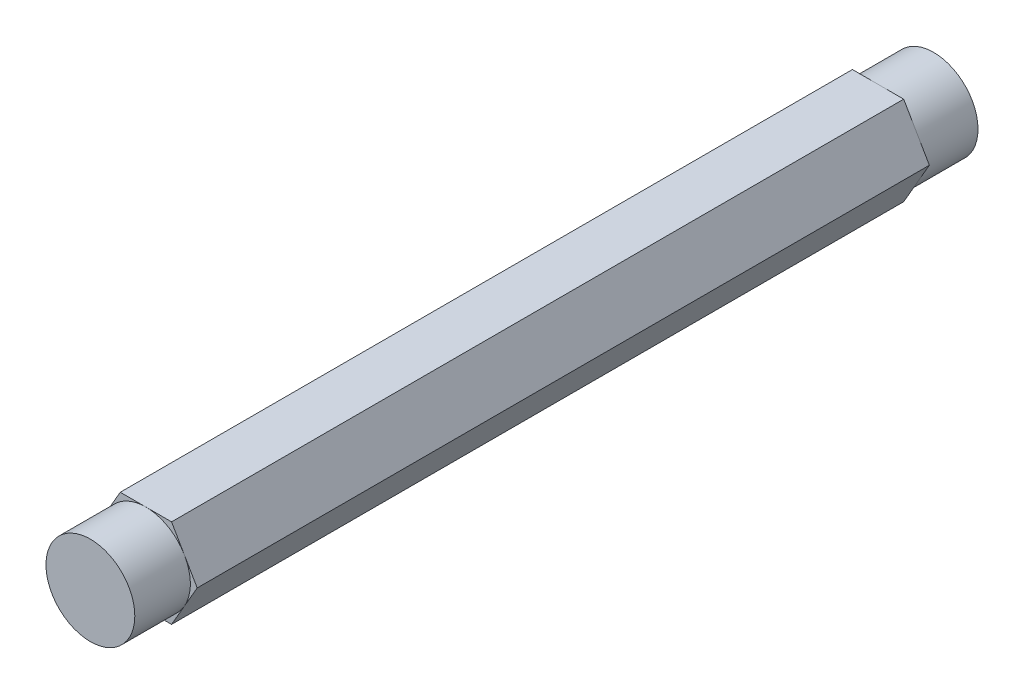
ISO-10303-21;
HEADER;
FILE_DESCRIPTION(('STEP AP214'),'2;1');
FILE_NAME('part.step','',(''),(''),'','','');
FILE_SCHEMA(('AUTOMOTIVE_DESIGN { 1 0 10303 214 1 1 1 1 }'));
ENDSEC;
DATA;
#1=APPLICATION_CONTEXT('core data for automotive mechanical design processes');
#2=APPLICATION_PROTOCOL_DEFINITION('international standard','automotive_design',2000,#1);
#3=PRODUCT_CONTEXT('',#1,'mechanical');
#4=PRODUCT('Part','Part','',(#3));
#5=PRODUCT_RELATED_PRODUCT_CATEGORY('part','',(#4));
#6=PRODUCT_DEFINITION_FORMATION('','',#4);
#7=PRODUCT_DEFINITION_CONTEXT('part definition',#1,'design');
#8=PRODUCT_DEFINITION('design','',#6,#7);
#9=PRODUCT_DEFINITION_SHAPE('','',#8);
#10=(LENGTH_UNIT() NAMED_UNIT(*) SI_UNIT(.MILLI.,.METRE.));
#11=(NAMED_UNIT(*) PLANE_ANGLE_UNIT() SI_UNIT($,.RADIAN.));
#12=(NAMED_UNIT(*) SI_UNIT($,.STERADIAN.) SOLID_ANGLE_UNIT());
#13=UNCERTAINTY_MEASURE_WITH_UNIT(LENGTH_MEASURE(1.E-05),#10,'distance_accuracy_value','');
#14=(GEOMETRIC_REPRESENTATION_CONTEXT(3) GLOBAL_UNCERTAINTY_ASSIGNED_CONTEXT((#13)) GLOBAL_UNIT_ASSIGNED_CONTEXT((#10,
#11,#12)) REPRESENTATION_CONTEXT('',''));
#15=CARTESIAN_POINT('',(0.,0.,0.));
#16=DIRECTION('',(0.,0.,1.));
#17=DIRECTION('',(1.,0.,0.));
#18=AXIS2_PLACEMENT_3D('',#15,#16,#17);
#19=CARTESIAN_POINT('',(0.,0.,112.6109));
#20=DIRECTION('',(0.,0.,1.));
#21=DIRECTION('',(1.,0.,0.));
#22=AXIS2_PLACEMENT_3D('',#19,#20,#21);
#23=PLANE('',#22);
#24=CARTESIAN_POINT('',(0.,0.,112.6109));
#25=DIRECTION('',(0.,0.,1.));
#26=DIRECTION('',(1.,0.,0.));
#27=AXIS2_PLACEMENT_3D('',#24,#25,#26);
#28=CIRCLE('',#27,6.35);
#29=CARTESIAN_POINT('',(5.49926131403118,3.175,112.6109));
#30=VERTEX_POINT('',#29);
#31=CARTESIAN_POINT('',(0.,6.35,112.6109));
#32=VERTEX_POINT('',#31);
#33=EDGE_CURVE('E46',#30,#32,#28,.T.);
#34=ORIENTED_EDGE('',*,*,#33,.F.);
#35=DIRECTION('',(-0.5,0.866025403784438,0.));
#36=VECTOR('',#35,1.);
#37=CARTESIAN_POINT('',(7.33234841870825,0.,112.6109));
#38=LINE('',#37,#36);
#39=CARTESIAN_POINT('',(3.66617420935412,6.35,112.6109));
#40=VERTEX_POINT('',#39);
#41=EDGE_CURVE('E139',#30,#40,#38,.T.);
#42=ORIENTED_EDGE('',*,*,#41,.T.);
#43=DIRECTION('',(-1.,0.,0.));
#44=VECTOR('',#43,1.);
#45=CARTESIAN_POINT('',(3.66617420935412,6.35,112.6109));
#46=LINE('',#45,#44);
#47=EDGE_CURVE('E152',#40,#32,#46,.T.);
#48=ORIENTED_EDGE('',*,*,#47,.T.);
#49=EDGE_LOOP('',(#34,#42,#48));
#50=FACE_BOUND('',#49,.T.);
#51=ADVANCED_FACE('F35',(#50),#23,.T.);
#52=CARTESIAN_POINT('',(-5.49926131403119,3.175,112.6109));
#53=VERTEX_POINT('',#52);
#54=EDGE_CURVE('E11',#32,#53,#28,.T.);
#55=ORIENTED_EDGE('',*,*,#54,.F.);
#56=CARTESIAN_POINT('',(-3.66617420935412,6.35,112.6109));
#57=VERTEX_POINT('',#56);
#58=EDGE_CURVE('E138',#32,#57,#46,.T.);
#59=ORIENTED_EDGE('',*,*,#58,.T.);
#60=DIRECTION('',(-0.5,-0.866025403784439,0.));
#61=VECTOR('',#60,1.);
#62=CARTESIAN_POINT('',(-3.66617420935412,6.35,112.6109));
#63=LINE('',#62,#61);
#64=EDGE_CURVE('E165',#57,#53,#63,.T.);
#65=ORIENTED_EDGE('',*,*,#64,.T.);
#66=EDGE_LOOP('',(#55,#59,#65));
#67=FACE_BOUND('',#66,.T.);
#68=ADVANCED_FACE('F265',(#67),#23,.T.);
#69=CARTESIAN_POINT('',(-5.49926131403118,-3.175,112.6109));
#70=VERTEX_POINT('',#69);
#71=EDGE_CURVE('E44',#53,#70,#28,.T.);
#72=ORIENTED_EDGE('',*,*,#71,.F.);
#73=CARTESIAN_POINT('',(-7.33234841870825,0.,112.6109));
#74=VERTEX_POINT('',#73);
#75=EDGE_CURVE('E164',#53,#74,#63,.T.);
#76=ORIENTED_EDGE('',*,*,#75,.T.);
#77=DIRECTION('',(0.5,-0.866025403784439,0.));
#78=VECTOR('',#77,1.);
#79=CARTESIAN_POINT('',(-7.33234841870825,0.,112.6109));
#80=LINE('',#79,#78);
#81=EDGE_CURVE('E169',#74,#70,#80,.T.);
#82=ORIENTED_EDGE('',*,*,#81,.T.);
#83=EDGE_LOOP('',(#72,#76,#82));
#84=FACE_BOUND('',#83,.T.);
#85=ADVANCED_FACE('F269',(#84),#23,.T.);
#86=CARTESIAN_POINT('',(0.,-6.35,112.6109));
#87=VERTEX_POINT('',#86);
#88=EDGE_CURVE('E61',#70,#87,#28,.T.);
#89=ORIENTED_EDGE('',*,*,#88,.F.);
#90=CARTESIAN_POINT('',(-3.66617420935412,-6.35,112.6109));
#91=VERTEX_POINT('',#90);
#92=EDGE_CURVE('E168',#70,#91,#80,.T.);
#93=ORIENTED_EDGE('',*,*,#92,.T.);
#94=DIRECTION('',(1.,0.,0.));
#95=VECTOR('',#94,1.);
#96=CARTESIAN_POINT('',(-3.66617420935412,-6.35,112.6109));
#97=LINE('',#96,#95);
#98=EDGE_CURVE('E173',#91,#87,#97,.T.);
#99=ORIENTED_EDGE('',*,*,#98,.T.);
#100=EDGE_LOOP('',(#89,#93,#99));
#101=FACE_BOUND('',#100,.T.);
#102=ADVANCED_FACE('F262',(#101),#23,.T.);
#103=CARTESIAN_POINT('',(5.49926131403119,-3.175,112.6109));
#104=VERTEX_POINT('',#103);
#105=EDGE_CURVE('E53',#87,#104,#28,.T.);
#106=ORIENTED_EDGE('',*,*,#105,.F.);
#107=CARTESIAN_POINT('',(3.66617420935413,-6.35,112.6109));
#108=VERTEX_POINT('',#107);
#109=EDGE_CURVE('E172',#87,#108,#97,.T.);
#110=ORIENTED_EDGE('',*,*,#109,.T.);
#111=DIRECTION('',(0.5,0.866025403784439,0.));
#112=VECTOR('',#111,1.);
#113=CARTESIAN_POINT('',(3.66617420935413,-6.35,112.6109));
#114=LINE('',#113,#112);
#115=EDGE_CURVE('E150',#108,#104,#114,.T.);
#116=ORIENTED_EDGE('',*,*,#115,.T.);
#117=EDGE_LOOP('',(#106,#110,#116));
#118=FACE_BOUND('',#117,.T.);
#119=ADVANCED_FACE('F256',(#118),#23,.T.);
#120=CARTESIAN_POINT('',(0.,0.,7.9375));
#121=DIRECTION('',(0.,0.,-1.));
#122=DIRECTION('',(-1.,0.,0.));
#123=AXIS2_PLACEMENT_3D('',#120,#121,#122);
#124=CYLINDRICAL_SURFACE('',#123,6.35);
#125=CARTESIAN_POINT('',(0.,0.,7.9375));
#126=DIRECTION('',(0.,0.,1.));
#127=DIRECTION('',(1.,0.,0.));
#128=AXIS2_PLACEMENT_3D('',#125,#126,#127);
#129=CIRCLE('',#128,6.35);
#130=CARTESIAN_POINT('',(5.49926131403118,3.175,7.9375));
#131=VERTEX_POINT('',#130);
#132=CARTESIAN_POINT('',(0.,6.35,7.9375));
#133=VERTEX_POINT('',#132);
#134=EDGE_CURVE('E156',#131,#133,#129,.T.);
#135=ORIENTED_EDGE('',*,*,#134,.F.);
#136=CARTESIAN_POINT('',(5.49926131403119,-3.175,7.9375));
#137=VERTEX_POINT('',#136);
#138=EDGE_CURVE('E159',#137,#131,#129,.T.);
#139=ORIENTED_EDGE('',*,*,#138,.F.);
#140=CARTESIAN_POINT('',(0.,-6.35,7.9375));
#141=VERTEX_POINT('',#140);
#142=EDGE_CURVE('E216',#141,#137,#129,.T.);
#143=ORIENTED_EDGE('',*,*,#142,.F.);
#144=CARTESIAN_POINT('',(-5.49926131403118,-3.175,7.9375));
#145=VERTEX_POINT('',#144);
#146=EDGE_CURVE('E222',#145,#141,#129,.T.);
#147=ORIENTED_EDGE('',*,*,#146,.F.);
#148=CARTESIAN_POINT('',(-5.49926131403119,3.175,7.9375));
#149=VERTEX_POINT('',#148);
#150=EDGE_CURVE('E227',#149,#145,#129,.T.);
#151=ORIENTED_EDGE('',*,*,#150,.F.);
#152=EDGE_CURVE('E158',#133,#149,#129,.T.);
#153=ORIENTED_EDGE('',*,*,#152,.F.);
#154=EDGE_LOOP('',(#135,#139,#143,#147,#151,#153));
#155=FACE_BOUND('',#154,.T.);
#156=CARTESIAN_POINT('',(0.,0.,0.));
#157=DIRECTION('',(0.,0.,1.));
#158=DIRECTION('',(1.,0.,0.));
#159=AXIS2_PLACEMENT_3D('',#156,#157,#158);
#160=CIRCLE('',#159,6.35);
#161=CARTESIAN_POINT('',(6.35,0.,0.));
#162=VERTEX_POINT('',#161);
#163=EDGE_CURVE('E39',#162,#162,#160,.T.);
#164=ORIENTED_EDGE('',*,*,#163,.T.);
#165=EDGE_LOOP('',(#164));
#166=FACE_BOUND('',#165,.T.);
#167=ADVANCED_FACE('F37',(#155,#166),#124,.T.);
#168=CARTESIAN_POINT('',(0.,0.,0.));
#169=DIRECTION('',(0.,0.,1.));
#170=DIRECTION('',(1.,0.,0.));
#171=AXIS2_PLACEMENT_3D('',#168,#169,#170);
#172=PLANE('',#171);
#173=ORIENTED_EDGE('',*,*,#163,.F.);
#174=EDGE_LOOP('',(#173));
#175=FACE_BOUND('',#174,.T.);
#176=ADVANCED_FACE('F255',(#175),#172,.F.);
#177=CARTESIAN_POINT('',(0.,0.,7.9375));
#178=DIRECTION('',(0.,0.,1.));
#179=DIRECTION('',(1.,0.,0.));
#180=AXIS2_PLACEMENT_3D('',#177,#178,#179);
#181=PLANE('',#180);
#182=DIRECTION('',(-0.5,0.866025403784438,0.));
#183=VECTOR('',#182,1.);
#184=CARTESIAN_POINT('',(7.33234841870825,0.,7.9375));
#185=LINE('',#184,#183);
#186=CARTESIAN_POINT('',(3.66617420935412,6.35,7.9375));
#187=VERTEX_POINT('',#186);
#188=EDGE_CURVE('E179',#131,#187,#185,.T.);
#189=ORIENTED_EDGE('',*,*,#188,.F.);
#190=ORIENTED_EDGE('',*,*,#134,.T.);
#191=DIRECTION('',(-1.,0.,0.));
#192=VECTOR('',#191,1.);
#193=CARTESIAN_POINT('',(3.66617420935412,6.35,7.9375));
#194=LINE('',#193,#192);
#195=EDGE_CURVE('E184',#187,#133,#194,.T.);
#196=ORIENTED_EDGE('',*,*,#195,.F.);
#197=EDGE_LOOP('',(#189,#190,#196));
#198=FACE_BOUND('',#197,.T.);
#199=ADVANCED_FACE('F253',(#198),#181,.F.);
#200=CARTESIAN_POINT('',(-3.66617420935412,6.35,7.9375));
#201=VERTEX_POINT('',#200);
#202=EDGE_CURVE('E183',#133,#201,#194,.T.);
#203=ORIENTED_EDGE('',*,*,#202,.F.);
#204=ORIENTED_EDGE('',*,*,#152,.T.);
#205=DIRECTION('',(-0.5,-0.866025403784439,0.));
#206=VECTOR('',#205,1.);
#207=CARTESIAN_POINT('',(-3.66617420935412,6.35,7.9375));
#208=LINE('',#207,#206);
#209=EDGE_CURVE('E188',#201,#149,#208,.T.);
#210=ORIENTED_EDGE('',*,*,#209,.F.);
#211=EDGE_LOOP('',(#203,#204,#210));
#212=FACE_BOUND('',#211,.T.);
#213=ADVANCED_FACE('F239',(#212),#181,.F.);
#214=CARTESIAN_POINT('',(-7.33234841870825,0.,7.9375));
#215=VERTEX_POINT('',#214);
#216=EDGE_CURVE('E187',#149,#215,#208,.T.);
#217=ORIENTED_EDGE('',*,*,#216,.F.);
#218=ORIENTED_EDGE('',*,*,#150,.T.);
#219=DIRECTION('',(0.5,-0.866025403784439,0.));
#220=VECTOR('',#219,1.);
#221=CARTESIAN_POINT('',(-7.33234841870825,0.,7.9375));
#222=LINE('',#221,#220);
#223=EDGE_CURVE('E192',#215,#145,#222,.T.);
#224=ORIENTED_EDGE('',*,*,#223,.F.);
#225=EDGE_LOOP('',(#217,#218,#224));
#226=FACE_BOUND('',#225,.T.);
#227=ADVANCED_FACE('F241',(#226),#181,.F.);
#228=CARTESIAN_POINT('',(-3.66617420935412,-6.35,7.9375));
#229=VERTEX_POINT('',#228);
#230=EDGE_CURVE('E191',#145,#229,#222,.T.);
#231=ORIENTED_EDGE('',*,*,#230,.F.);
#232=ORIENTED_EDGE('',*,*,#146,.T.);
#233=DIRECTION('',(1.,0.,0.));
#234=VECTOR('',#233,1.);
#235=CARTESIAN_POINT('',(-3.66617420935412,-6.35,7.9375));
#236=LINE('',#235,#234);
#237=EDGE_CURVE('E196',#229,#141,#236,.T.);
#238=ORIENTED_EDGE('',*,*,#237,.F.);
#239=EDGE_LOOP('',(#231,#232,#238));
#240=FACE_BOUND('',#239,.T.);
#241=ADVANCED_FACE('F308',(#240),#181,.F.);
#242=CARTESIAN_POINT('',(3.66617420935413,-6.35,7.9375));
#243=VERTEX_POINT('',#242);
#244=EDGE_CURVE('E195',#141,#243,#236,.T.);
#245=ORIENTED_EDGE('',*,*,#244,.F.);
#246=ORIENTED_EDGE('',*,*,#142,.T.);
#247=DIRECTION('',(0.5,0.866025403784439,0.));
#248=VECTOR('',#247,1.);
#249=CARTESIAN_POINT('',(3.66617420935413,-6.35,7.9375));
#250=LINE('',#249,#248);
#251=EDGE_CURVE('E176',#243,#137,#250,.T.);
#252=ORIENTED_EDGE('',*,*,#251,.F.);
#253=EDGE_LOOP('',(#245,#246,#252));
#254=FACE_BOUND('',#253,.T.);
#255=ADVANCED_FACE('F303',(#254),#181,.F.);
#256=CARTESIAN_POINT('',(7.33234841870825,0.,7.9375));
#257=VERTEX_POINT('',#256);
#258=EDGE_CURVE('E180',#137,#257,#250,.T.);
#259=ORIENTED_EDGE('',*,*,#258,.F.);
#260=ORIENTED_EDGE('',*,*,#138,.T.);
#261=EDGE_CURVE('E181',#257,#131,#185,.T.);
#262=ORIENTED_EDGE('',*,*,#261,.F.);
#263=EDGE_LOOP('',(#259,#260,#262));
#264=FACE_BOUND('',#263,.T.);
#265=ADVANCED_FACE('F298',(#264),#181,.F.);
#266=CARTESIAN_POINT('',(3.66617420935413,-6.35,112.6109));
#267=DIRECTION('',(-0.866025403784438,0.5,0.));
#268=DIRECTION('',(-0.5,-0.866025403784439,0.));
#269=AXIS2_PLACEMENT_3D('',#266,#267,#268);
#270=PLANE('',#269);
#271=ORIENTED_EDGE('',*,*,#251,.T.);
#272=ORIENTED_EDGE('',*,*,#258,.T.);
#273=DIRECTION('',(0.,0.,-1.));
#274=VECTOR('',#273,1.);
#275=CARTESIAN_POINT('',(7.33234841870825,0.,112.6109));
#276=LINE('',#275,#274);
#277=CARTESIAN_POINT('',(7.33234841870825,0.,112.6109));
#278=VERTEX_POINT('',#277);
#279=EDGE_CURVE('E211',#278,#257,#276,.T.);
#280=ORIENTED_EDGE('',*,*,#279,.F.);
#281=EDGE_CURVE('E134',#104,#278,#114,.T.);
#282=ORIENTED_EDGE('',*,*,#281,.F.);
#283=ORIENTED_EDGE('',*,*,#115,.F.);
#284=DIRECTION('',(0.,0.,-1.));
#285=VECTOR('',#284,1.);
#286=CARTESIAN_POINT('',(3.66617420935413,-6.35,112.6109));
#287=LINE('',#286,#285);
#288=EDGE_CURVE('E175',#108,#243,#287,.T.);
#289=ORIENTED_EDGE('',*,*,#288,.T.);
#290=EDGE_LOOP('',(#271,#272,#280,#282,#283,#289));
#291=FACE_BOUND('',#290,.T.);
#292=ADVANCED_FACE('F296',(#291),#270,.F.);
#293=CARTESIAN_POINT('',(7.33234841870825,0.,112.6109));
#294=DIRECTION('',(-0.866025403784438,-0.5,0.));
#295=DIRECTION('',(0.5,-0.866025403784438,0.));
#296=AXIS2_PLACEMENT_3D('',#293,#294,#295);
#297=PLANE('',#296);
#298=ORIENTED_EDGE('',*,*,#261,.T.);
#299=ORIENTED_EDGE('',*,*,#188,.T.);
#300=DIRECTION('',(0.,0.,-1.));
#301=VECTOR('',#300,1.);
#302=CARTESIAN_POINT('',(3.66617420935412,6.35,112.6109));
#303=LINE('',#302,#301);
#304=EDGE_CURVE('E146',#40,#187,#303,.T.);
#305=ORIENTED_EDGE('',*,*,#304,.F.);
#306=ORIENTED_EDGE('',*,*,#41,.F.);
#307=EDGE_CURVE('E128',#278,#30,#38,.T.);
#308=ORIENTED_EDGE('',*,*,#307,.F.);
#309=ORIENTED_EDGE('',*,*,#279,.T.);
#310=EDGE_LOOP('',(#298,#299,#305,#306,#308,#309));
#311=FACE_BOUND('',#310,.T.);
#312=ADVANCED_FACE('F144',(#311),#297,.F.);
#313=CARTESIAN_POINT('',(3.66617420935412,6.35,112.6109));
#314=DIRECTION('',(0.,-1.,0.));
#315=DIRECTION('',(1.,0.,0.));
#316=AXIS2_PLACEMENT_3D('',#313,#314,#315);
#317=PLANE('',#316);
#318=ORIENTED_EDGE('',*,*,#195,.T.);
#319=ORIENTED_EDGE('',*,*,#202,.T.);
#320=DIRECTION('',(0.,0.,-1.));
#321=VECTOR('',#320,1.);
#322=CARTESIAN_POINT('',(-3.66617420935412,6.35,112.6109));
#323=LINE('',#322,#321);
#324=EDGE_CURVE('E207',#57,#201,#323,.T.);
#325=ORIENTED_EDGE('',*,*,#324,.F.);
#326=ORIENTED_EDGE('',*,*,#58,.F.);
#327=ORIENTED_EDGE('',*,*,#47,.F.);
#328=ORIENTED_EDGE('',*,*,#304,.T.);
#329=EDGE_LOOP('',(#318,#319,#325,#326,#327,#328));
#330=FACE_BOUND('',#329,.T.);
#331=ADVANCED_FACE('F250',(#330),#317,.F.);
#332=CARTESIAN_POINT('',(-3.66617420935412,6.35,112.6109));
#333=DIRECTION('',(0.866025403784438,-0.5,0.));
#334=DIRECTION('',(0.5,0.866025403784439,0.));
#335=AXIS2_PLACEMENT_3D('',#332,#333,#334);
#336=PLANE('',#335);
#337=ORIENTED_EDGE('',*,*,#209,.T.);
#338=ORIENTED_EDGE('',*,*,#216,.T.);
#339=DIRECTION('',(0.,0.,-1.));
#340=VECTOR('',#339,1.);
#341=CARTESIAN_POINT('',(-7.33234841870825,0.,112.6109));
#342=LINE('',#341,#340);
#343=EDGE_CURVE('E204',#74,#215,#342,.T.);
#344=ORIENTED_EDGE('',*,*,#343,.F.);
#345=ORIENTED_EDGE('',*,*,#75,.F.);
#346=ORIENTED_EDGE('',*,*,#64,.F.);
#347=ORIENTED_EDGE('',*,*,#324,.T.);
#348=EDGE_LOOP('',(#337,#338,#344,#345,#346,#347));
#349=FACE_BOUND('',#348,.T.);
#350=ADVANCED_FACE('F244',(#349),#336,.F.);
#351=CARTESIAN_POINT('',(-7.33234841870825,0.,112.6109));
#352=DIRECTION('',(0.866025403784438,0.5,0.));
#353=DIRECTION('',(-0.5,0.866025403784439,0.));
#354=AXIS2_PLACEMENT_3D('',#351,#352,#353);
#355=PLANE('',#354);
#356=ORIENTED_EDGE('',*,*,#223,.T.);
#357=ORIENTED_EDGE('',*,*,#230,.T.);
#358=DIRECTION('',(0.,0.,-1.));
#359=VECTOR('',#358,1.);
#360=CARTESIAN_POINT('',(-3.66617420935412,-6.35,112.6109));
#361=LINE('',#360,#359);
#362=EDGE_CURVE('E201',#91,#229,#361,.T.);
#363=ORIENTED_EDGE('',*,*,#362,.F.);
#364=ORIENTED_EDGE('',*,*,#92,.F.);
#365=ORIENTED_EDGE('',*,*,#81,.F.);
#366=ORIENTED_EDGE('',*,*,#343,.T.);
#367=EDGE_LOOP('',(#356,#357,#363,#364,#365,#366));
#368=FACE_BOUND('',#367,.T.);
#369=ADVANCED_FACE('F281',(#368),#355,.F.);
#370=CARTESIAN_POINT('',(-3.66617420935412,-6.35,112.6109));
#371=DIRECTION('',(0.,1.,0.));
#372=DIRECTION('',(-1.,0.,0.));
#373=AXIS2_PLACEMENT_3D('',#370,#371,#372);
#374=PLANE('',#373);
#375=ORIENTED_EDGE('',*,*,#237,.T.);
#376=ORIENTED_EDGE('',*,*,#244,.T.);
#377=ORIENTED_EDGE('',*,*,#288,.F.);
#378=ORIENTED_EDGE('',*,*,#109,.F.);
#379=ORIENTED_EDGE('',*,*,#98,.F.);
#380=ORIENTED_EDGE('',*,*,#362,.T.);
#381=EDGE_LOOP('',(#375,#376,#377,#378,#379,#380));
#382=FACE_BOUND('',#381,.T.);
#383=ADVANCED_FACE('F274',(#382),#374,.F.);
#384=EDGE_CURVE('E132',#104,#30,#28,.T.);
#385=ORIENTED_EDGE('',*,*,#384,.F.);
#386=ORIENTED_EDGE('',*,*,#281,.T.);
#387=ORIENTED_EDGE('',*,*,#307,.T.);
#388=EDGE_LOOP('',(#385,#386,#387));
#389=FACE_BOUND('',#388,.T.);
#390=ADVANCED_FACE('F130',(#389),#23,.T.);
#391=CARTESIAN_POINT('',(0.,0.,120.5484));
#392=DIRECTION('',(0.,0.,-1.));
#393=DIRECTION('',(-1.,0.,0.));
#394=AXIS2_PLACEMENT_3D('',#391,#392,#393);
#395=CYLINDRICAL_SURFACE('',#394,6.35);
#396=CARTESIAN_POINT('',(0.,0.,120.5484));
#397=DIRECTION('',(0.,0.,1.));
#398=DIRECTION('',(1.,0.,0.));
#399=AXIS2_PLACEMENT_3D('',#396,#397,#398);
#400=CIRCLE('',#399,6.35);
#401=CARTESIAN_POINT('',(6.35,0.,120.5484));
#402=VERTEX_POINT('',#401);
#403=EDGE_CURVE('E154',#402,#402,#400,.T.);
#404=ORIENTED_EDGE('',*,*,#403,.F.);
#405=EDGE_LOOP('',(#404));
#406=FACE_BOUND('',#405,.T.);
#407=ORIENTED_EDGE('',*,*,#33,.T.);
#408=ORIENTED_EDGE('',*,*,#54,.T.);
#409=ORIENTED_EDGE('',*,*,#71,.T.);
#410=ORIENTED_EDGE('',*,*,#88,.T.);
#411=ORIENTED_EDGE('',*,*,#105,.T.);
#412=ORIENTED_EDGE('',*,*,#384,.T.);
#413=EDGE_LOOP('',(#407,#408,#409,#410,#411,#412));
#414=FACE_BOUND('',#413,.T.);
#415=ADVANCED_FACE('F155',(#406,#414),#395,.T.);
#416=CARTESIAN_POINT('',(0.,0.,120.5484));
#417=DIRECTION('',(0.,0.,1.));
#418=DIRECTION('',(1.,0.,0.));
#419=AXIS2_PLACEMENT_3D('',#416,#417,#418);
#420=PLANE('',#419);
#421=ORIENTED_EDGE('',*,*,#403,.T.);
#422=EDGE_LOOP('',(#421));
#423=FACE_BOUND('',#422,.T.);
#424=ADVANCED_FACE('F279',(#423),#420,.T.);
#425=CLOSED_SHELL('',(#51,#68,#85,#102,#119,#167,#176,#199,#213,#227,#241,#255,#265,#292,#312,
#331,#350,#369,#383,#390,#415,#424));
#426=MANIFOLD_SOLID_BREP('B2',#425);
#427=ADVANCED_BREP_SHAPE_REPRESENTATION('',(#18,#426),#14);
#428=SHAPE_DEFINITION_REPRESENTATION(#9,#427);
ENDSEC;
END-ISO-10303-21;
